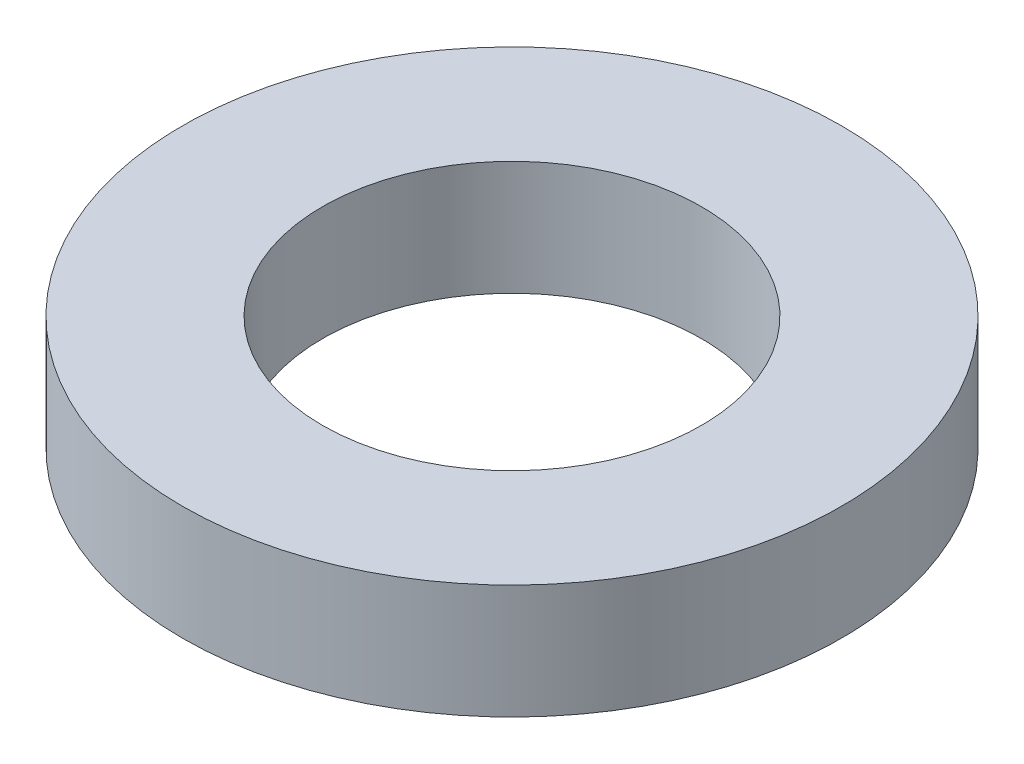
ISO-10303-21;
HEADER;
FILE_DESCRIPTION(('STEP AP214'),'2;1');
FILE_NAME('part.step','',(''),(''),'','','');
FILE_SCHEMA(('AUTOMOTIVE_DESIGN { 1 0 10303 214 1 1 1 1 }'));
ENDSEC;
DATA;
#1=APPLICATION_CONTEXT('core data for automotive mechanical design processes');
#2=APPLICATION_PROTOCOL_DEFINITION('international standard','automotive_design',2000,#1);
#3=PRODUCT_CONTEXT('',#1,'mechanical');
#4=PRODUCT('Part','Part','',(#3));
#5=PRODUCT_RELATED_PRODUCT_CATEGORY('part','',(#4));
#6=PRODUCT_DEFINITION_FORMATION('','',#4);
#7=PRODUCT_DEFINITION_CONTEXT('part definition',#1,'design');
#8=PRODUCT_DEFINITION('design','',#6,#7);
#9=PRODUCT_DEFINITION_SHAPE('','',#8);
#10=(LENGTH_UNIT() NAMED_UNIT(*) SI_UNIT(.MILLI.,.METRE.));
#11=(NAMED_UNIT(*) PLANE_ANGLE_UNIT() SI_UNIT($,.RADIAN.));
#12=(NAMED_UNIT(*) SI_UNIT($,.STERADIAN.) SOLID_ANGLE_UNIT());
#13=UNCERTAINTY_MEASURE_WITH_UNIT(LENGTH_MEASURE(1.E-05),#10,'distance_accuracy_value','');
#14=(GEOMETRIC_REPRESENTATION_CONTEXT(3) GLOBAL_UNCERTAINTY_ASSIGNED_CONTEXT((#13)) GLOBAL_UNIT_ASSIGNED_CONTEXT((#10,
#11,#12)) REPRESENTATION_CONTEXT('',''));
#15=CARTESIAN_POINT('',(0.,0.,0.));
#16=DIRECTION('',(0.,0.,1.));
#17=DIRECTION('',(1.,0.,0.));
#18=AXIS2_PLACEMENT_3D('',#15,#16,#17);
#19=CARTESIAN_POINT('',(0.,10.,0.));
#20=DIRECTION('',(0.,1.,0.));
#21=DIRECTION('',(0.,0.,1.));
#22=AXIS2_PLACEMENT_3D('',#19,#20,#21);
#23=PLANE('',#22);
#24=CARTESIAN_POINT('',(0.,10.,0.));
#25=DIRECTION('',(0.,1.,0.));
#26=DIRECTION('',(0.,0.,1.));
#27=AXIS2_PLACEMENT_3D('',#24,#25,#26);
#28=CIRCLE('',#27,28.832991776632);
#29=CARTESIAN_POINT('',(0.,10.,28.832991776632));
#30=VERTEX_POINT('',#29);
#31=EDGE_CURVE('E10',#30,#30,#28,.T.);
#32=ORIENTED_EDGE('',*,*,#31,.T.);
#33=EDGE_LOOP('',(#32));
#34=FACE_BOUND('',#33,.T.);
#35=CARTESIAN_POINT('',(0.,10.,0.));
#36=DIRECTION('',(0.,1.,0.));
#37=DIRECTION('',(0.,0.,1.));
#38=AXIS2_PLACEMENT_3D('',#35,#36,#37);
#39=CIRCLE('',#38,16.5795051176193);
#40=CARTESIAN_POINT('',(0.,10.,16.5795051176193));
#41=VERTEX_POINT('',#40);
#42=EDGE_CURVE('E54',#41,#41,#39,.T.);
#43=ORIENTED_EDGE('',*,*,#42,.F.);
#44=EDGE_LOOP('',(#43));
#45=FACE_BOUND('',#44,.T.);
#46=ADVANCED_FACE('F41',(#34,#45),#23,.T.);
#47=CARTESIAN_POINT('',(0.,0.,0.));
#48=DIRECTION('',(0.,1.,0.));
#49=DIRECTION('',(0.,0.,1.));
#50=AXIS2_PLACEMENT_3D('',#47,#48,#49);
#51=PLANE('',#50);
#52=CARTESIAN_POINT('',(0.,0.,0.));
#53=DIRECTION('',(0.,1.,0.));
#54=DIRECTION('',(0.,0.,1.));
#55=AXIS2_PLACEMENT_3D('',#52,#53,#54);
#56=CIRCLE('',#55,28.832991776632);
#57=CARTESIAN_POINT('',(0.,0.,28.832991776632));
#58=VERTEX_POINT('',#57);
#59=EDGE_CURVE('E45',#58,#58,#56,.T.);
#60=ORIENTED_EDGE('',*,*,#59,.F.);
#61=EDGE_LOOP('',(#60));
#62=FACE_BOUND('',#61,.T.);
#63=CARTESIAN_POINT('',(0.,0.,0.));
#64=DIRECTION('',(0.,1.,0.));
#65=DIRECTION('',(0.,0.,1.));
#66=AXIS2_PLACEMENT_3D('',#63,#64,#65);
#67=CIRCLE('',#66,16.5795051176193);
#68=CARTESIAN_POINT('',(0.,0.,16.5795051176193));
#69=VERTEX_POINT('',#68);
#70=EDGE_CURVE('E56',#69,#69,#67,.T.);
#71=ORIENTED_EDGE('',*,*,#70,.T.);
#72=EDGE_LOOP('',(#71));
#73=FACE_BOUND('',#72,.T.);
#74=ADVANCED_FACE('F68',(#62,#73),#51,.F.);
#75=CARTESIAN_POINT('',(0.,10.,0.));
#76=DIRECTION('',(0.,-1.,0.));
#77=DIRECTION('',(0.,0.,-1.));
#78=AXIS2_PLACEMENT_3D('',#75,#76,#77);
#79=CYLINDRICAL_SURFACE('',#78,28.832991776632);
#80=ORIENTED_EDGE('',*,*,#31,.F.);
#81=EDGE_LOOP('',(#80));
#82=FACE_BOUND('',#81,.T.);
#83=ORIENTED_EDGE('',*,*,#59,.T.);
#84=EDGE_LOOP('',(#83));
#85=FACE_BOUND('',#84,.T.);
#86=ADVANCED_FACE('F43',(#82,#85),#79,.T.);
#87=CARTESIAN_POINT('',(0.,10.,0.));
#88=DIRECTION('',(0.,-1.,0.));
#89=DIRECTION('',(0.,0.,-1.));
#90=AXIS2_PLACEMENT_3D('',#87,#88,#89);
#91=CYLINDRICAL_SURFACE('',#90,16.5795051176193);
#92=ORIENTED_EDGE('',*,*,#42,.T.);
#93=EDGE_LOOP('',(#92));
#94=FACE_BOUND('',#93,.T.);
#95=ORIENTED_EDGE('',*,*,#70,.F.);
#96=EDGE_LOOP('',(#95));
#97=FACE_BOUND('',#96,.T.);
#98=ADVANCED_FACE('F64',(#94,#97),#91,.F.);
#99=CLOSED_SHELL('',(#46,#74,#86,#98));
#100=MANIFOLD_SOLID_BREP('B2',#99);
#101=ADVANCED_BREP_SHAPE_REPRESENTATION('',(#18,#100),#14);
#102=SHAPE_DEFINITION_REPRESENTATION(#9,#101);
ENDSEC;
END-ISO-10303-21;
